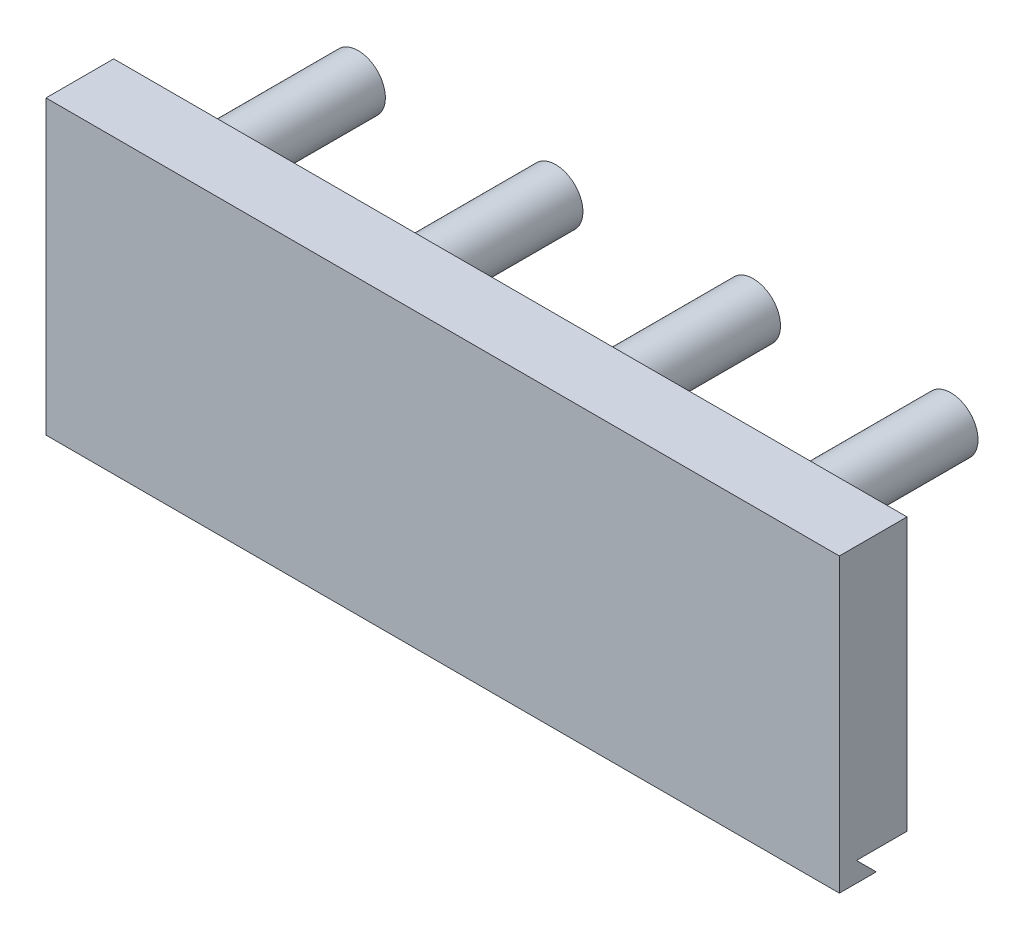
ISO-10303-21;
HEADER;
FILE_DESCRIPTION(('STEP AP214'),'2;1');
FILE_NAME('part.step','',(''),(''),'','','');
FILE_SCHEMA(('AUTOMOTIVE_DESIGN { 1 0 10303 214 1 1 1 1 }'));
ENDSEC;
DATA;
#1=APPLICATION_CONTEXT('core data for automotive mechanical design processes');
#2=APPLICATION_PROTOCOL_DEFINITION('international standard','automotive_design',2000,#1);
#3=PRODUCT_CONTEXT('',#1,'mechanical');
#4=PRODUCT('Part','Part','',(#3));
#5=PRODUCT_RELATED_PRODUCT_CATEGORY('part','',(#4));
#6=PRODUCT_DEFINITION_FORMATION('','',#4);
#7=PRODUCT_DEFINITION_CONTEXT('part definition',#1,'design');
#8=PRODUCT_DEFINITION('design','',#6,#7);
#9=PRODUCT_DEFINITION_SHAPE('','',#8);
#10=(LENGTH_UNIT() NAMED_UNIT(*) SI_UNIT(.MILLI.,.METRE.));
#11=(NAMED_UNIT(*) PLANE_ANGLE_UNIT() SI_UNIT($,.RADIAN.));
#12=(NAMED_UNIT(*) SI_UNIT($,.STERADIAN.) SOLID_ANGLE_UNIT());
#13=UNCERTAINTY_MEASURE_WITH_UNIT(LENGTH_MEASURE(1.E-05),#10,'distance_accuracy_value','');
#14=(GEOMETRIC_REPRESENTATION_CONTEXT(3) GLOBAL_UNCERTAINTY_ASSIGNED_CONTEXT((#13)) GLOBAL_UNIT_ASSIGNED_CONTEXT((#10,
#11,#12)) REPRESENTATION_CONTEXT('',''));
#15=CARTESIAN_POINT('',(0.,0.,0.));
#16=DIRECTION('',(0.,0.,1.));
#17=DIRECTION('',(1.,0.,0.));
#18=AXIS2_PLACEMENT_3D('',#15,#16,#17);
#19=CARTESIAN_POINT('',(51.,-17.5,8.7));
#20=DIRECTION('',(-1.,0.,0.));
#21=DIRECTION('',(0.,0.,1.));
#22=AXIS2_PLACEMENT_3D('',#19,#20,#21);
#23=PLANE('',#22);
#24=DIRECTION('',(0.,1.,0.));
#25=VECTOR('',#24,1.);
#26=CARTESIAN_POINT('',(51.,-17.5,0.));
#27=LINE('',#26,#25);
#28=CARTESIAN_POINT('',(51.,-17.5,0.));
#29=VERTEX_POINT('',#28);
#30=CARTESIAN_POINT('',(51.,17.5,0.));
#31=VERTEX_POINT('',#30);
#32=EDGE_CURVE('E86',#29,#31,#27,.T.);
#33=ORIENTED_EDGE('',*,*,#32,.T.);
#34=DIRECTION('',(0.,0.,-1.));
#35=VECTOR('',#34,1.);
#36=CARTESIAN_POINT('',(51.,17.5,8.7));
#37=LINE('',#36,#35);
#38=CARTESIAN_POINT('',(51.,17.5,8.7));
#39=VERTEX_POINT('',#38);
#40=EDGE_CURVE('E11',#39,#31,#37,.T.);
#41=ORIENTED_EDGE('',*,*,#40,.F.);
#42=DIRECTION('',(0.,1.,0.));
#43=VECTOR('',#42,1.);
#44=CARTESIAN_POINT('',(51.,-17.5,8.7));
#45=LINE('',#44,#43);
#46=CARTESIAN_POINT('',(51.,-20.0455844122716,8.7));
#47=VERTEX_POINT('',#46);
#48=EDGE_CURVE('E102',#47,#39,#45,.T.);
#49=ORIENTED_EDGE('',*,*,#48,.F.);
#50=DIRECTION('',(0.,0.,1.));
#51=VECTOR('',#50,1.);
#52=CARTESIAN_POINT('',(51.,-20.0455844122716,8.7));
#53=LINE('',#52,#51);
#54=CARTESIAN_POINT('',(51.,-20.0455844122716,3.95441558772844));
#55=VERTEX_POINT('',#54);
#56=EDGE_CURVE('E128',#55,#47,#53,.T.);
#57=ORIENTED_EDGE('',*,*,#56,.F.);
#58=DIRECTION('',(0.,-0.707106781186549,-0.707106781186546));
#59=VECTOR('',#58,1.);
#60=CARTESIAN_POINT('',(51.,-20.0455844122716,3.95441558772844));
#61=LINE('',#60,#59);
#62=CARTESIAN_POINT('',(51.,-17.5,6.5));
#63=VERTEX_POINT('',#62);
#64=EDGE_CURVE('E90',#63,#55,#61,.T.);
#65=ORIENTED_EDGE('',*,*,#64,.F.);
#66=DIRECTION('',(0.,0.,-1.));
#67=VECTOR('',#66,1.);
#68=CARTESIAN_POINT('',(51.,-17.5,8.7));
#69=LINE('',#68,#67);
#70=EDGE_CURVE('E82',#63,#29,#69,.T.);
#71=ORIENTED_EDGE('',*,*,#70,.T.);
#72=EDGE_LOOP('',(#33,#41,#49,#57,#65,#71));
#73=FACE_BOUND('',#72,.T.);
#74=ADVANCED_FACE('F39',(#73),#23,.F.);
#75=CARTESIAN_POINT('',(-51.,17.5,8.7));
#76=DIRECTION('',(0.,-1.,0.));
#77=DIRECTION('',(0.,0.,-1.));
#78=AXIS2_PLACEMENT_3D('',#75,#76,#77);
#79=PLANE('',#78);
#80=DIRECTION('',(-1.,0.,0.));
#81=VECTOR('',#80,1.);
#82=CARTESIAN_POINT('',(-51.,17.5,0.));
#83=LINE('',#82,#81);
#84=CARTESIAN_POINT('',(-51.,17.5,0.));
#85=VERTEX_POINT('',#84);
#86=EDGE_CURVE('E106',#31,#85,#83,.T.);
#87=ORIENTED_EDGE('',*,*,#86,.T.);
#88=DIRECTION('',(0.,0.,-1.));
#89=VECTOR('',#88,1.);
#90=CARTESIAN_POINT('',(-51.,17.5,8.7));
#91=LINE('',#90,#89);
#92=CARTESIAN_POINT('',(-51.,17.5,8.7));
#93=VERTEX_POINT('',#92);
#94=EDGE_CURVE('E46',#93,#85,#91,.T.);
#95=ORIENTED_EDGE('',*,*,#94,.F.);
#96=DIRECTION('',(-1.,0.,0.));
#97=VECTOR('',#96,1.);
#98=CARTESIAN_POINT('',(-51.,17.5,8.7));
#99=LINE('',#98,#97);
#100=EDGE_CURVE('E62',#39,#93,#99,.T.);
#101=ORIENTED_EDGE('',*,*,#100,.F.);
#102=ORIENTED_EDGE('',*,*,#40,.T.);
#103=EDGE_LOOP('',(#87,#95,#101,#102));
#104=FACE_BOUND('',#103,.T.);
#105=ADVANCED_FACE('F123',(#104),#79,.F.);
#106=CARTESIAN_POINT('',(-51.,-17.5,8.7));
#107=DIRECTION('',(1.,0.,0.));
#108=DIRECTION('',(0.,0.,-1.));
#109=AXIS2_PLACEMENT_3D('',#106,#107,#108);
#110=PLANE('',#109);
#111=DIRECTION('',(0.,-1.,0.));
#112=VECTOR('',#111,1.);
#113=CARTESIAN_POINT('',(-51.,-17.5,0.));
#114=LINE('',#113,#112);
#115=CARTESIAN_POINT('',(-51.,-17.5,0.));
#116=VERTEX_POINT('',#115);
#117=EDGE_CURVE('E103',#85,#116,#114,.T.);
#118=ORIENTED_EDGE('',*,*,#117,.T.);
#119=DIRECTION('',(0.,0.,-1.));
#120=VECTOR('',#119,1.);
#121=CARTESIAN_POINT('',(-51.,-17.5,8.7));
#122=LINE('',#121,#120);
#123=CARTESIAN_POINT('',(-51.,-17.5,6.5));
#124=VERTEX_POINT('',#123);
#125=EDGE_CURVE('E92',#124,#116,#122,.T.);
#126=ORIENTED_EDGE('',*,*,#125,.F.);
#127=DIRECTION('',(0.,-0.707106781186549,-0.707106781186546));
#128=VECTOR('',#127,1.);
#129=CARTESIAN_POINT('',(-51.,-20.0455844122716,3.95441558772844));
#130=LINE('',#129,#128);
#131=CARTESIAN_POINT('',(-51.,-20.0455844122716,3.95441558772844));
#132=VERTEX_POINT('',#131);
#133=EDGE_CURVE('E53',#124,#132,#130,.T.);
#134=ORIENTED_EDGE('',*,*,#133,.T.);
#135=DIRECTION('',(0.,0.,1.));
#136=VECTOR('',#135,1.);
#137=CARTESIAN_POINT('',(-51.,-20.0455844122716,8.7));
#138=LINE('',#137,#136);
#139=CARTESIAN_POINT('',(-51.,-20.0455844122716,8.7));
#140=VERTEX_POINT('',#139);
#141=EDGE_CURVE('E140',#132,#140,#138,.T.);
#142=ORIENTED_EDGE('',*,*,#141,.T.);
#143=DIRECTION('',(0.,-1.,0.));
#144=VECTOR('',#143,1.);
#145=CARTESIAN_POINT('',(-51.,-17.5,8.7));
#146=LINE('',#145,#144);
#147=EDGE_CURVE('E93',#93,#140,#146,.T.);
#148=ORIENTED_EDGE('',*,*,#147,.F.);
#149=ORIENTED_EDGE('',*,*,#94,.T.);
#150=EDGE_LOOP('',(#118,#126,#134,#142,#148,#149));
#151=FACE_BOUND('',#150,.T.);
#152=ADVANCED_FACE('F120',(#151),#110,.F.);
#153=CARTESIAN_POINT('',(-51.,-17.5,8.7));
#154=DIRECTION('',(0.,1.,0.));
#155=DIRECTION('',(0.,0.,1.));
#156=AXIS2_PLACEMENT_3D('',#153,#154,#155);
#157=PLANE('',#156);
#158=ORIENTED_EDGE('',*,*,#70,.F.);
#159=DIRECTION('',(-1.,0.,0.));
#160=VECTOR('',#159,1.);
#161=CARTESIAN_POINT('',(51.,-17.5,6.5));
#162=LINE('',#161,#160);
#163=EDGE_CURVE('E137',#63,#124,#162,.T.);
#164=ORIENTED_EDGE('',*,*,#163,.T.);
#165=ORIENTED_EDGE('',*,*,#125,.T.);
#166=DIRECTION('',(1.,0.,0.));
#167=VECTOR('',#166,1.);
#168=CARTESIAN_POINT('',(-51.,-17.5,0.));
#169=LINE('',#168,#167);
#170=EDGE_CURVE('E96',#116,#29,#169,.T.);
#171=ORIENTED_EDGE('',*,*,#170,.T.);
#172=EDGE_LOOP('',(#158,#164,#165,#171));
#173=FACE_BOUND('',#172,.T.);
#174=ADVANCED_FACE('F97',(#173),#157,.F.);
#175=CARTESIAN_POINT('',(0.,0.,8.7));
#176=DIRECTION('',(0.,0.,-1.));
#177=DIRECTION('',(-1.,0.,0.));
#178=AXIS2_PLACEMENT_3D('',#175,#176,#177);
#179=PLANE('',#178);
#180=ORIENTED_EDGE('',*,*,#48,.T.);
#181=ORIENTED_EDGE('',*,*,#100,.T.);
#182=ORIENTED_EDGE('',*,*,#147,.T.);
#183=DIRECTION('',(-1.,0.,0.));
#184=VECTOR('',#183,1.);
#185=CARTESIAN_POINT('',(51.,-20.0455844122716,8.7));
#186=LINE('',#185,#184);
#187=EDGE_CURVE('E107',#47,#140,#186,.T.);
#188=ORIENTED_EDGE('',*,*,#187,.F.);
#189=EDGE_LOOP('',(#180,#181,#182,#188));
#190=FACE_BOUND('',#189,.T.);
#191=ADVANCED_FACE('F131',(#190),#179,.F.);
#192=CARTESIAN_POINT('',(0.,0.,0.));
#193=DIRECTION('',(0.,0.,-1.));
#194=DIRECTION('',(-1.,0.,0.));
#195=AXIS2_PLACEMENT_3D('',#192,#193,#194);
#196=PLANE('',#195);
#197=CARTESIAN_POINT('',(-39.57,10.64,0.));
#198=DIRECTION('',(0.,0.,-1.));
#199=DIRECTION('',(-1.,0.,0.));
#200=AXIS2_PLACEMENT_3D('',#197,#198,#199);
#201=CIRCLE('',#200,3.5);
#202=CARTESIAN_POINT('',(-43.07,10.64,0.));
#203=VERTEX_POINT('',#202);
#204=EDGE_CURVE('E275',#203,#203,#201,.T.);
#205=ORIENTED_EDGE('',*,*,#204,.F.);
#206=EDGE_LOOP('',(#205));
#207=FACE_BOUND('',#206,.T.);
#208=CARTESIAN_POINT('',(-14.17,10.64,0.));
#209=DIRECTION('',(0.,0.,-1.));
#210=DIRECTION('',(-1.,0.,0.));
#211=AXIS2_PLACEMENT_3D('',#208,#209,#210);
#212=CIRCLE('',#211,3.5);
#213=CARTESIAN_POINT('',(-17.67,10.64,0.));
#214=VERTEX_POINT('',#213);
#215=EDGE_CURVE('E281',#214,#214,#212,.T.);
#216=ORIENTED_EDGE('',*,*,#215,.F.);
#217=EDGE_LOOP('',(#216));
#218=FACE_BOUND('',#217,.T.);
#219=CARTESIAN_POINT('',(11.23,10.64,0.));
#220=DIRECTION('',(0.,0.,-1.));
#221=DIRECTION('',(-1.,0.,0.));
#222=AXIS2_PLACEMENT_3D('',#219,#220,#221);
#223=CIRCLE('',#222,3.5);
#224=CARTESIAN_POINT('',(7.73,10.64,0.));
#225=VERTEX_POINT('',#224);
#226=EDGE_CURVE('E287',#225,#225,#223,.T.);
#227=ORIENTED_EDGE('',*,*,#226,.F.);
#228=EDGE_LOOP('',(#227));
#229=FACE_BOUND('',#228,.T.);
#230=CARTESIAN_POINT('',(36.63,10.64,0.));
#231=DIRECTION('',(0.,0.,-1.));
#232=DIRECTION('',(-1.,0.,0.));
#233=AXIS2_PLACEMENT_3D('',#230,#231,#232);
#234=CIRCLE('',#233,3.5);
#235=CARTESIAN_POINT('',(33.13,10.64,0.));
#236=VERTEX_POINT('',#235);
#237=EDGE_CURVE('E290',#236,#236,#234,.T.);
#238=ORIENTED_EDGE('',*,*,#237,.F.);
#239=EDGE_LOOP('',(#238));
#240=FACE_BOUND('',#239,.T.);
#241=ORIENTED_EDGE('',*,*,#32,.F.);
#242=ORIENTED_EDGE('',*,*,#170,.F.);
#243=ORIENTED_EDGE('',*,*,#117,.F.);
#244=ORIENTED_EDGE('',*,*,#86,.F.);
#245=EDGE_LOOP('',(#241,#242,#243,#244));
#246=FACE_BOUND('',#245,.T.);
#247=ADVANCED_FACE('F105',(#207,#218,#229,#240,#246),#196,.T.);
#248=CARTESIAN_POINT('',(51.,-20.0455844122716,8.7));
#249=DIRECTION('',(0.,-1.,0.));
#250=DIRECTION('',(0.,0.,-1.));
#251=AXIS2_PLACEMENT_3D('',#248,#249,#250);
#252=PLANE('',#251);
#253=ORIENTED_EDGE('',*,*,#141,.F.);
#254=DIRECTION('',(-1.,0.,0.));
#255=VECTOR('',#254,1.);
#256=CARTESIAN_POINT('',(51.,-20.0455844122716,3.95441558772844));
#257=LINE('',#256,#255);
#258=EDGE_CURVE('E111',#55,#132,#257,.T.);
#259=ORIENTED_EDGE('',*,*,#258,.F.);
#260=ORIENTED_EDGE('',*,*,#56,.T.);
#261=ORIENTED_EDGE('',*,*,#187,.T.);
#262=EDGE_LOOP('',(#253,#259,#260,#261));
#263=FACE_BOUND('',#262,.T.);
#264=ADVANCED_FACE('F136',(#263),#252,.T.);
#265=CARTESIAN_POINT('',(51.,-20.0455844122716,3.95441558772844));
#266=DIRECTION('',(0.,0.707106781186546,-0.707106781186549));
#267=DIRECTION('',(0.,0.707106781186549,0.707106781186546));
#268=AXIS2_PLACEMENT_3D('',#265,#266,#267);
#269=PLANE('',#268);
#270=ORIENTED_EDGE('',*,*,#133,.F.);
#271=ORIENTED_EDGE('',*,*,#163,.F.);
#272=ORIENTED_EDGE('',*,*,#64,.T.);
#273=ORIENTED_EDGE('',*,*,#258,.T.);
#274=EDGE_LOOP('',(#270,#271,#272,#273));
#275=FACE_BOUND('',#274,.T.);
#276=ADVANCED_FACE('F148',(#275),#269,.T.);
#277=CARTESIAN_POINT('',(36.63,10.64,-20.));
#278=DIRECTION('',(0.,0.,1.));
#279=DIRECTION('',(1.,0.,0.));
#280=AXIS2_PLACEMENT_3D('',#277,#278,#279);
#281=CYLINDRICAL_SURFACE('',#280,3.5);
#282=CARTESIAN_POINT('',(36.63,10.64,-20.));
#283=DIRECTION('',(0.,0.,-1.));
#284=DIRECTION('',(-1.,0.,0.));
#285=AXIS2_PLACEMENT_3D('',#282,#283,#284);
#286=CIRCLE('',#285,3.5);
#287=CARTESIAN_POINT('',(33.13,10.64,-20.));
#288=VERTEX_POINT('',#287);
#289=EDGE_CURVE('E145',#288,#288,#286,.T.);
#290=ORIENTED_EDGE('',*,*,#289,.F.);
#291=EDGE_LOOP('',(#290));
#292=FACE_BOUND('',#291,.T.);
#293=ORIENTED_EDGE('',*,*,#237,.T.);
#294=EDGE_LOOP('',(#293));
#295=FACE_BOUND('',#294,.T.);
#296=ADVANCED_FACE('F153',(#292,#295),#281,.T.);
#297=CARTESIAN_POINT('',(36.63,10.64,-20.));
#298=DIRECTION('',(0.,0.,-1.));
#299=DIRECTION('',(-1.,0.,0.));
#300=AXIS2_PLACEMENT_3D('',#297,#298,#299);
#301=PLANE('',#300);
#302=ORIENTED_EDGE('',*,*,#289,.T.);
#303=EDGE_LOOP('',(#302));
#304=FACE_BOUND('',#303,.T.);
#305=ADVANCED_FACE('F160',(#304),#301,.T.);
#306=CARTESIAN_POINT('',(11.23,10.64,-20.));
#307=DIRECTION('',(0.,0.,1.));
#308=DIRECTION('',(1.,0.,0.));
#309=AXIS2_PLACEMENT_3D('',#306,#307,#308);
#310=CYLINDRICAL_SURFACE('',#309,3.5);
#311=CARTESIAN_POINT('',(11.23,10.64,-20.));
#312=DIRECTION('',(0.,0.,-1.));
#313=DIRECTION('',(-1.,0.,0.));
#314=AXIS2_PLACEMENT_3D('',#311,#312,#313);
#315=CIRCLE('',#314,3.5);
#316=CARTESIAN_POINT('',(7.73,10.64,-20.));
#317=VERTEX_POINT('',#316);
#318=EDGE_CURVE('E284',#317,#317,#315,.T.);
#319=ORIENTED_EDGE('',*,*,#318,.F.);
#320=EDGE_LOOP('',(#319));
#321=FACE_BOUND('',#320,.T.);
#322=ORIENTED_EDGE('',*,*,#226,.T.);
#323=EDGE_LOOP('',(#322));
#324=FACE_BOUND('',#323,.T.);
#325=ADVANCED_FACE('F209',(#321,#324),#310,.T.);
#326=CARTESIAN_POINT('',(11.23,10.64,-20.));
#327=DIRECTION('',(0.,0.,-1.));
#328=DIRECTION('',(-1.,0.,0.));
#329=AXIS2_PLACEMENT_3D('',#326,#327,#328);
#330=PLANE('',#329);
#331=ORIENTED_EDGE('',*,*,#318,.T.);
#332=EDGE_LOOP('',(#331));
#333=FACE_BOUND('',#332,.T.);
#334=ADVANCED_FACE('F219',(#333),#330,.T.);
#335=CARTESIAN_POINT('',(-14.17,10.64,-20.));
#336=DIRECTION('',(0.,0.,1.));
#337=DIRECTION('',(1.,0.,0.));
#338=AXIS2_PLACEMENT_3D('',#335,#336,#337);
#339=CYLINDRICAL_SURFACE('',#338,3.5);
#340=CARTESIAN_POINT('',(-14.17,10.64,-20.));
#341=DIRECTION('',(0.,0.,-1.));
#342=DIRECTION('',(-1.,0.,0.));
#343=AXIS2_PLACEMENT_3D('',#340,#341,#342);
#344=CIRCLE('',#343,3.5);
#345=CARTESIAN_POINT('',(-17.67,10.64,-20.));
#346=VERTEX_POINT('',#345);
#347=EDGE_CURVE('E278',#346,#346,#344,.T.);
#348=ORIENTED_EDGE('',*,*,#347,.F.);
#349=EDGE_LOOP('',(#348));
#350=FACE_BOUND('',#349,.T.);
#351=ORIENTED_EDGE('',*,*,#215,.T.);
#352=EDGE_LOOP('',(#351));
#353=FACE_BOUND('',#352,.T.);
#354=ADVANCED_FACE('F229',(#350,#353),#339,.T.);
#355=CARTESIAN_POINT('',(-14.17,10.64,-20.));
#356=DIRECTION('',(0.,0.,-1.));
#357=DIRECTION('',(-1.,0.,0.));
#358=AXIS2_PLACEMENT_3D('',#355,#356,#357);
#359=PLANE('',#358);
#360=ORIENTED_EDGE('',*,*,#347,.T.);
#361=EDGE_LOOP('',(#360));
#362=FACE_BOUND('',#361,.T.);
#363=ADVANCED_FACE('F239',(#362),#359,.T.);
#364=CARTESIAN_POINT('',(-39.57,10.64,-20.));
#365=DIRECTION('',(0.,0.,1.));
#366=DIRECTION('',(1.,0.,0.));
#367=AXIS2_PLACEMENT_3D('',#364,#365,#366);
#368=CYLINDRICAL_SURFACE('',#367,3.5);
#369=CARTESIAN_POINT('',(-39.57,10.64,-20.));
#370=DIRECTION('',(0.,0.,-1.));
#371=DIRECTION('',(-1.,0.,0.));
#372=AXIS2_PLACEMENT_3D('',#369,#370,#371);
#373=CIRCLE('',#372,3.5);
#374=CARTESIAN_POINT('',(-43.07,10.64,-20.));
#375=VERTEX_POINT('',#374);
#376=EDGE_CURVE('E274',#375,#375,#373,.T.);
#377=ORIENTED_EDGE('',*,*,#376,.F.);
#378=EDGE_LOOP('',(#377));
#379=FACE_BOUND('',#378,.T.);
#380=ORIENTED_EDGE('',*,*,#204,.T.);
#381=EDGE_LOOP('',(#380));
#382=FACE_BOUND('',#381,.T.);
#383=ADVANCED_FACE('F249',(#379,#382),#368,.T.);
#384=CARTESIAN_POINT('',(-39.57,10.64,-20.));
#385=DIRECTION('',(0.,0.,-1.));
#386=DIRECTION('',(-1.,0.,0.));
#387=AXIS2_PLACEMENT_3D('',#384,#385,#386);
#388=PLANE('',#387);
#389=ORIENTED_EDGE('',*,*,#376,.T.);
#390=EDGE_LOOP('',(#389));
#391=FACE_BOUND('',#390,.T.);
#392=ADVANCED_FACE('F259',(#391),#388,.T.);
#393=CLOSED_SHELL('',(#74,#105,#152,#174,#191,#247,#264,#276,#296,#305,#325,#334,#354,#363,#383,#392));
#394=MANIFOLD_SOLID_BREP('B2',#393);
#395=ADVANCED_BREP_SHAPE_REPRESENTATION('',(#18,#394),#14);
#396=SHAPE_DEFINITION_REPRESENTATION(#9,#395);
ENDSEC;
END-ISO-10303-21;
